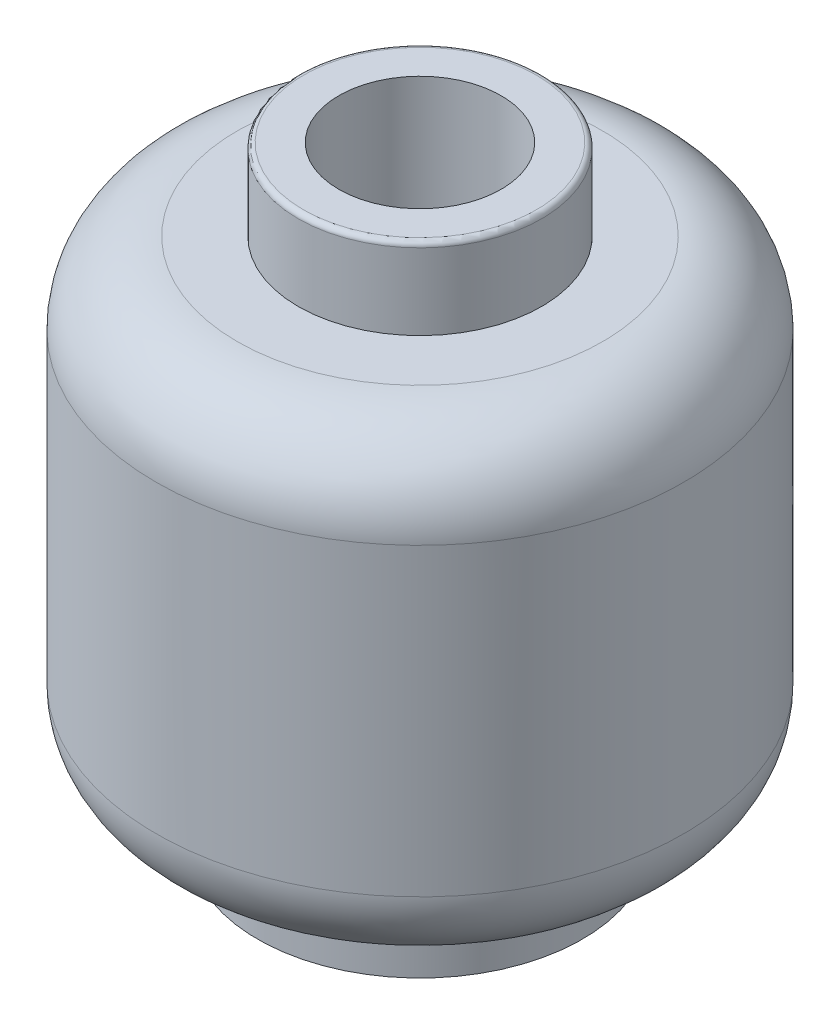
ISO-10303-21;
HEADER;
FILE_DESCRIPTION(('STEP AP214'),'2;1');
FILE_NAME('part.step','',(''),(''),'','','');
FILE_SCHEMA(('AUTOMOTIVE_DESIGN { 1 0 10303 214 1 1 1 1 }'));
ENDSEC;
DATA;
#1=APPLICATION_CONTEXT('core data for automotive mechanical design processes');
#2=APPLICATION_PROTOCOL_DEFINITION('international standard','automotive_design',2000,#1);
#3=PRODUCT_CONTEXT('',#1,'mechanical');
#4=PRODUCT('Part','Part','',(#3));
#5=PRODUCT_RELATED_PRODUCT_CATEGORY('part','',(#4));
#6=PRODUCT_DEFINITION_FORMATION('','',#4);
#7=PRODUCT_DEFINITION_CONTEXT('part definition',#1,'design');
#8=PRODUCT_DEFINITION('design','',#6,#7);
#9=PRODUCT_DEFINITION_SHAPE('','',#8);
#10=(LENGTH_UNIT() NAMED_UNIT(*) SI_UNIT(.MILLI.,.METRE.));
#11=(NAMED_UNIT(*) PLANE_ANGLE_UNIT() SI_UNIT($,.RADIAN.));
#12=(NAMED_UNIT(*) SI_UNIT($,.STERADIAN.) SOLID_ANGLE_UNIT());
#13=UNCERTAINTY_MEASURE_WITH_UNIT(LENGTH_MEASURE(1.E-05),#10,'distance_accuracy_value','');
#14=(GEOMETRIC_REPRESENTATION_CONTEXT(3) GLOBAL_UNCERTAINTY_ASSIGNED_CONTEXT((#13)) GLOBAL_UNIT_ASSIGNED_CONTEXT((#10,
#11,#12)) REPRESENTATION_CONTEXT('',''));
#15=CARTESIAN_POINT('',(0.,0.,0.));
#16=DIRECTION('',(0.,0.,1.));
#17=DIRECTION('',(1.,0.,0.));
#18=AXIS2_PLACEMENT_3D('',#15,#16,#17);
#19=CARTESIAN_POINT('',(5.159375,11.90625,-5.159375));
#20=DIRECTION('',(0.,-1.,0.));
#21=DIRECTION('',(0.,0.,-1.));
#22=AXIS2_PLACEMENT_3D('',#19,#20,#21);
#23=CYLINDRICAL_SURFACE('',#22,5.159375);
#24=CARTESIAN_POINT('',(5.159375,2.778125,-5.159375));
#25=DIRECTION('',(0.,-1.,0.));
#26=DIRECTION('',(0.,0.,-1.));
#27=AXIS2_PLACEMENT_3D('',#24,#25,#26);
#28=CIRCLE('',#27,5.159375);
#29=CARTESIAN_POINT('',(5.159375,2.778125,-10.31875));
#30=VERTEX_POINT('',#29);
#31=EDGE_CURVE('E54',#30,#30,#28,.F.);
#32=ORIENTED_EDGE('',*,*,#31,.T.);
#33=EDGE_LOOP('',(#32));
#34=FACE_BOUND('',#33,.T.);
#35=CARTESIAN_POINT('',(5.159375,8.73125,-5.159375));
#36=DIRECTION('',(0.,1.,0.));
#37=DIRECTION('',(0.,0.,1.));
#38=AXIS2_PLACEMENT_3D('',#35,#36,#37);
#39=CIRCLE('',#38,5.159375);
#40=CARTESIAN_POINT('',(5.159375,8.73125,0.));
#41=VERTEX_POINT('',#40);
#42=EDGE_CURVE('E60',#41,#41,#39,.F.);
#43=ORIENTED_EDGE('',*,*,#42,.T.);
#44=EDGE_LOOP('',(#43));
#45=FACE_BOUND('',#44,.T.);
#46=ADVANCED_FACE('F34',(#34,#45),#23,.T.);
#47=CARTESIAN_POINT('',(5.159375,10.31875,-5.159375));
#48=DIRECTION('',(0.,1.,0.));
#49=DIRECTION('',(0.,0.,1.));
#50=AXIS2_PLACEMENT_3D('',#47,#48,#49);
#51=PLANE('',#50);
#52=CARTESIAN_POINT('',(5.159375,10.31875,-5.159375));
#53=DIRECTION('',(0.,1.,0.));
#54=DIRECTION('',(0.,0.,1.));
#55=AXIS2_PLACEMENT_3D('',#52,#53,#54);
#56=CIRCLE('',#55,3.571875);
#57=CARTESIAN_POINT('',(5.159375,10.31875,-1.5875));
#58=VERTEX_POINT('',#57);
#59=EDGE_CURVE('E48',#58,#58,#56,.T.);
#60=ORIENTED_EDGE('',*,*,#59,.T.);
#61=EDGE_LOOP('',(#60));
#62=FACE_BOUND('',#61,.T.);
#63=CARTESIAN_POINT('',(5.159375,10.31875,-5.159375));
#64=DIRECTION('',(0.,1.,0.));
#65=DIRECTION('',(0.,0.,1.));
#66=AXIS2_PLACEMENT_3D('',#63,#64,#65);
#67=CIRCLE('',#66,2.38125);
#68=CARTESIAN_POINT('',(5.159375,10.31875,-2.778125));
#69=VERTEX_POINT('',#68);
#70=EDGE_CURVE('E68',#69,#69,#67,.T.);
#71=ORIENTED_EDGE('',*,*,#70,.F.);
#72=EDGE_LOOP('',(#71));
#73=FACE_BOUND('',#72,.T.);
#74=ADVANCED_FACE('F119',(#62,#73),#51,.T.);
#75=CARTESIAN_POINT('',(5.159375,10.31875,-5.159375));
#76=DIRECTION('',(0.,1.,0.));
#77=DIRECTION('',(0.,0.,1.));
#78=AXIS2_PLACEMENT_3D('',#75,#76,#77);
#79=CYLINDRICAL_SURFACE('',#78,2.38125);
#80=CARTESIAN_POINT('',(5.159375,11.80465,-5.159375));
#81=DIRECTION('',(0.,1.,0.));
#82=DIRECTION('',(0.,0.,1.));
#83=AXIS2_PLACEMENT_3D('',#80,#81,#82);
#84=CIRCLE('',#83,2.38125);
#85=CARTESIAN_POINT('',(5.159375,11.80465,-2.778125));
#86=VERTEX_POINT('',#85);
#87=EDGE_CURVE('E10',#86,#86,#84,.F.);
#88=ORIENTED_EDGE('',*,*,#87,.T.);
#89=EDGE_LOOP('',(#88));
#90=FACE_BOUND('',#89,.T.);
#91=ORIENTED_EDGE('',*,*,#70,.T.);
#92=EDGE_LOOP('',(#91));
#93=FACE_BOUND('',#92,.T.);
#94=ADVANCED_FACE('F110',(#90,#93),#79,.T.);
#95=CARTESIAN_POINT('',(5.159375,11.90625,-5.159375));
#96=DIRECTION('',(0.,1.,0.));
#97=DIRECTION('',(0.,0.,1.));
#98=AXIS2_PLACEMENT_3D('',#95,#96,#97);
#99=PLANE('',#98);
#100=CARTESIAN_POINT('',(5.159375,11.90625,-5.159375));
#101=DIRECTION('',(0.,1.,0.));
#102=DIRECTION('',(0.,0.,1.));
#103=AXIS2_PLACEMENT_3D('',#100,#101,#102);
#104=CIRCLE('',#103,2.27965);
#105=CARTESIAN_POINT('',(5.159375,11.90625,-2.879725));
#106=VERTEX_POINT('',#105);
#107=EDGE_CURVE('E42',#106,#106,#104,.T.);
#108=ORIENTED_EDGE('',*,*,#107,.T.);
#109=EDGE_LOOP('',(#108));
#110=FACE_BOUND('',#109,.T.);
#111=CARTESIAN_POINT('',(5.159375,11.90625,-5.159375));
#112=DIRECTION('',(0.,1.,0.));
#113=DIRECTION('',(0.,0.,1.));
#114=AXIS2_PLACEMENT_3D('',#111,#112,#113);
#115=CIRCLE('',#114,1.5875);
#116=CARTESIAN_POINT('',(5.159375,11.90625,-3.571875));
#117=VERTEX_POINT('',#116);
#118=EDGE_CURVE('E89',#117,#117,#115,.T.);
#119=ORIENTED_EDGE('',*,*,#118,.F.);
#120=EDGE_LOOP('',(#119));
#121=FACE_BOUND('',#120,.T.);
#122=ADVANCED_FACE('F107',(#110,#121),#99,.T.);
#123=CARTESIAN_POINT('',(5.159375,1.190625,-5.159375));
#124=DIRECTION('',(0.,-1.,0.));
#125=DIRECTION('',(0.,0.,-1.));
#126=AXIS2_PLACEMENT_3D('',#123,#124,#125);
#127=PLANE('',#126);
#128=CARTESIAN_POINT('',(5.159375,1.190625,-5.159375));
#129=DIRECTION('',(0.,-1.,0.));
#130=DIRECTION('',(0.,0.,-1.));
#131=AXIS2_PLACEMENT_3D('',#128,#129,#130);
#132=CIRCLE('',#131,3.571875);
#133=CARTESIAN_POINT('',(5.159375,1.190625,-8.73125));
#134=VERTEX_POINT('',#133);
#135=EDGE_CURVE('E64',#134,#134,#132,.T.);
#136=ORIENTED_EDGE('',*,*,#135,.T.);
#137=EDGE_LOOP('',(#136));
#138=FACE_BOUND('',#137,.T.);
#139=CARTESIAN_POINT('',(5.159375,1.190625,-5.159375));
#140=DIRECTION('',(0.,-1.,0.));
#141=DIRECTION('',(0.,0.,-1.));
#142=AXIS2_PLACEMENT_3D('',#139,#140,#141);
#143=CIRCLE('',#142,3.175);
#144=CARTESIAN_POINT('',(5.159375,1.190625,-8.334375));
#145=VERTEX_POINT('',#144);
#146=EDGE_CURVE('E72',#145,#145,#143,.T.);
#147=ORIENTED_EDGE('',*,*,#146,.F.);
#148=EDGE_LOOP('',(#147));
#149=FACE_BOUND('',#148,.T.);
#150=ADVANCED_FACE('F109',(#138,#149),#127,.T.);
#151=CARTESIAN_POINT('',(5.159375,1.190625,-5.159375));
#152=DIRECTION('',(0.,-1.,0.));
#153=DIRECTION('',(0.,0.,-1.));
#154=AXIS2_PLACEMENT_3D('',#151,#152,#153);
#155=CYLINDRICAL_SURFACE('',#154,3.175);
#156=CARTESIAN_POINT('',(5.159375,0.,-5.159375));
#157=DIRECTION('',(0.,-1.,0.));
#158=DIRECTION('',(0.,0.,-1.));
#159=AXIS2_PLACEMENT_3D('',#156,#157,#158);
#160=CIRCLE('',#159,3.175);
#161=CARTESIAN_POINT('',(5.159375,0.,-8.334375));
#162=VERTEX_POINT('',#161);
#163=EDGE_CURVE('E73',#162,#162,#160,.T.);
#164=CARTESIAN_POINT('',(5.159375,1.190625,-8.334375));
#165=CARTESIAN_POINT('',(5.159375,1.17822265625,-8.334375));
#166=CARTESIAN_POINT('',(5.159375,1.1658203125,-8.334375));
#167=CARTESIAN_POINT('',(5.159375,1.141015625,-8.334375));
#168=CARTESIAN_POINT('',(5.159375,1.12861328125,-8.334375));
#169=CARTESIAN_POINT('',(5.159375,1.10380859375,-8.334375));
#170=CARTESIAN_POINT('',(5.159375,1.09140625,-8.334375));
#171=CARTESIAN_POINT('',(5.159375,1.0666015625,-8.334375));
#172=CARTESIAN_POINT('',(5.159375,1.05419921875,-8.334375));
#173=CARTESIAN_POINT('',(5.159375,1.02939453125,-8.334375));
#174=CARTESIAN_POINT('',(5.159375,1.0169921875,-8.334375));
#175=CARTESIAN_POINT('',(5.159375,0.9921875,-8.334375));
#176=CARTESIAN_POINT('',(5.159375,0.97978515625,-8.334375));
#177=CARTESIAN_POINT('',(5.159375,0.95498046875,-8.334375));
#178=CARTESIAN_POINT('',(5.159375,0.942578125,-8.334375));
#179=CARTESIAN_POINT('',(5.159375,0.9177734375,-8.334375));
#180=CARTESIAN_POINT('',(5.159375,0.90537109375,-8.334375));
#181=CARTESIAN_POINT('',(5.159375,0.88056640625,-8.334375));
#182=CARTESIAN_POINT('',(5.159375,0.8681640625,-8.334375));
#183=CARTESIAN_POINT('',(5.159375,0.843359375,-8.334375));
#184=CARTESIAN_POINT('',(5.159375,0.83095703125,-8.334375));
#185=CARTESIAN_POINT('',(5.159375,0.80615234375,-8.334375));
#186=CARTESIAN_POINT('',(5.159375,0.79375,-8.334375));
#187=CARTESIAN_POINT('',(5.159375,0.7689453125,-8.334375));
#188=CARTESIAN_POINT('',(5.159375,0.75654296875,-8.334375));
#189=CARTESIAN_POINT('',(5.159375,0.73173828125,-8.334375));
#190=CARTESIAN_POINT('',(5.159375,0.7193359375,-8.334375));
#191=CARTESIAN_POINT('',(5.159375,0.69453125,-8.334375));
#192=CARTESIAN_POINT('',(5.159375,0.68212890625,-8.334375));
#193=CARTESIAN_POINT('',(5.159375,0.65732421875,-8.334375));
#194=CARTESIAN_POINT('',(5.159375,0.644921875,-8.334375));
#195=CARTESIAN_POINT('',(5.159375,0.6201171875,-8.334375));
#196=CARTESIAN_POINT('',(5.159375,0.60771484375,-8.334375));
#197=CARTESIAN_POINT('',(5.159375,0.58291015625,-8.334375));
#198=CARTESIAN_POINT('',(5.159375,0.5705078125,-8.334375));
#199=CARTESIAN_POINT('',(5.159375,0.545703125,-8.334375));
#200=CARTESIAN_POINT('',(5.159375,0.53330078125,-8.334375));
#201=CARTESIAN_POINT('',(5.159375,0.50849609375,-8.334375));
#202=CARTESIAN_POINT('',(5.159375,0.49609375,-8.334375));
#203=CARTESIAN_POINT('',(5.159375,0.4712890625,-8.334375));
#204=CARTESIAN_POINT('',(5.159375,0.45888671875,-8.334375));
#205=CARTESIAN_POINT('',(5.159375,0.43408203125,-8.334375));
#206=CARTESIAN_POINT('',(5.159375,0.4216796875,-8.334375));
#207=CARTESIAN_POINT('',(5.159375,0.396875,-8.334375));
#208=CARTESIAN_POINT('',(5.159375,0.38447265625,-8.334375));
#209=CARTESIAN_POINT('',(5.159375,0.35966796875,-8.334375));
#210=CARTESIAN_POINT('',(5.159375,0.347265625,-8.334375));
#211=CARTESIAN_POINT('',(5.159375,0.3224609375,-8.334375));
#212=CARTESIAN_POINT('',(5.159375,0.31005859375,-8.334375));
#213=CARTESIAN_POINT('',(5.159375,0.28525390625,-8.334375));
#214=CARTESIAN_POINT('',(5.159375,0.2728515625,-8.334375));
#215=CARTESIAN_POINT('',(5.159375,0.248046875,-8.334375));
#216=CARTESIAN_POINT('',(5.159375,0.23564453125,-8.334375));
#217=CARTESIAN_POINT('',(5.159375,0.21083984375,-8.334375));
#218=CARTESIAN_POINT('',(5.159375,0.1984375,-8.334375));
#219=CARTESIAN_POINT('',(5.159375,0.1736328125,-8.334375));
#220=CARTESIAN_POINT('',(5.159375,0.16123046875,-8.334375));
#221=CARTESIAN_POINT('',(5.159375,0.13642578125,-8.334375));
#222=CARTESIAN_POINT('',(5.159375,0.1240234375,-8.334375));
#223=CARTESIAN_POINT('',(5.159375,0.0992187500000001,-8.334375));
#224=CARTESIAN_POINT('',(5.159375,0.08681640625,-8.334375));
#225=CARTESIAN_POINT('',(5.159375,0.06201171875,-8.334375));
#226=CARTESIAN_POINT('',(5.159375,0.049609375,-8.334375));
#227=CARTESIAN_POINT('',(5.159375,0.0248046875,-8.334375));
#228=CARTESIAN_POINT('',(5.159375,0.01240234375,-8.334375));
#229=CARTESIAN_POINT('',(5.159375,0.,-8.334375));
#230=B_SPLINE_CURVE_WITH_KNOTS('',3,(#164,#165,#166,#167,#168,#169,#170,#171,#172,#173,#174,
#175,#176,#177,#178,#179,#180,#181,#182,#183,#184,#185,#186,#187,#188,#189,#190,#191,#192,#193,
#194,#195,#196,#197,#198,#199,#200,#201,#202,#203,#204,#205,#206,#207,#208,#209,#210,#211,#212,
#213,#214,#215,#216,#217,#218,#219,#220,#221,#222,#223,#224,#225,#226,#227,#228,#229),
.UNSPECIFIED.,.F.,.F.,(4,2,2,2,2,2,2,2,2,2,2,2,2,2,2,2,2,2,2,2,2,2,2,2,2,2,2,2,2,2,2,2,4),(0.,
0.03720703125,0.0744140625,0.11162109375,0.148828125,0.18603515625,0.2232421875,0.26044921875,
0.29765625,0.33486328125,0.3720703125,0.40927734375,0.446484375,0.48369140625,0.5208984375,
0.55810546875,0.5953125,0.63251953125,0.6697265625,0.70693359375,0.744140625,0.78134765625,
0.8185546875,0.85576171875,0.89296875,0.93017578125,0.9673828125,1.00458984375,1.041796875,
1.07900390625,1.1162109375,1.15341796875,1.190625),.UNSPECIFIED.);
#231=EDGE_CURVE('BSEAM116',#145,#162,#230,.T.);
#232=ORIENTED_EDGE('',*,*,#146,.T.);
#233=ORIENTED_EDGE('',*,*,#163,.F.);
#234=ORIENTED_EDGE('',*,*,#231,.T.);
#235=ORIENTED_EDGE('',*,*,#231,.F.);
#236=EDGE_LOOP('',(#232,#234,#233,#235));
#237=FACE_BOUND('',#236,.T.);
#238=ADVANCED_FACE('F116',(#237),#155,.T.);
#239=CARTESIAN_POINT('',(5.159375,0.,-5.159375));
#240=DIRECTION('',(0.,1.,0.));
#241=DIRECTION('',(0.,0.,1.));
#242=AXIS2_PLACEMENT_3D('',#239,#240,#241);
#243=PLANE('',#242);
#244=CARTESIAN_POINT('',(5.159375,0.,-5.159375));
#245=DIRECTION('',(0.,-1.,0.));
#246=DIRECTION('',(0.,0.,-1.));
#247=AXIS2_PLACEMENT_3D('',#244,#245,#246);
#248=CIRCLE('',#247,2.38125);
#249=CARTESIAN_POINT('',(5.159375,0.,-7.540625));
#250=VERTEX_POINT('',#249);
#251=EDGE_CURVE('E81',#250,#250,#248,.T.);
#252=ORIENTED_EDGE('',*,*,#251,.F.);
#253=EDGE_LOOP('',(#252));
#254=FACE_BOUND('',#253,.T.);
#255=ORIENTED_EDGE('',*,*,#163,.T.);
#256=EDGE_LOOP('',(#255));
#257=FACE_BOUND('',#256,.T.);
#258=ADVANCED_FACE('F132',(#254,#257),#243,.F.);
#259=CARTESIAN_POINT('',(5.159375,8.73125,-5.159375));
#260=DIRECTION('',(0.,-1.,0.));
#261=DIRECTION('',(0.,0.,-1.));
#262=AXIS2_PLACEMENT_3D('',#259,#260,#261);
#263=CYLINDRICAL_SURFACE('',#262,2.38125);
#264=CARTESIAN_POINT('',(5.159375,8.73125,-5.159375));
#265=DIRECTION('',(0.,-1.,0.));
#266=DIRECTION('',(0.,0.,-1.));
#267=AXIS2_PLACEMENT_3D('',#264,#265,#266);
#268=CIRCLE('',#267,2.38125);
#269=CARTESIAN_POINT('',(5.159375,8.73125,-7.540625));
#270=VERTEX_POINT('',#269);
#271=EDGE_CURVE('E77',#270,#270,#268,.T.);
#272=ORIENTED_EDGE('',*,*,#271,.F.);
#273=EDGE_LOOP('',(#272));
#274=FACE_BOUND('',#273,.T.);
#275=ORIENTED_EDGE('',*,*,#251,.T.);
#276=EDGE_LOOP('',(#275));
#277=FACE_BOUND('',#276,.T.);
#278=ADVANCED_FACE('F180',(#274,#277),#263,.F.);
#279=CARTESIAN_POINT('',(5.159375,8.73125,-5.159375));
#280=DIRECTION('',(0.,-1.,0.));
#281=DIRECTION('',(0.,0.,-1.));
#282=AXIS2_PLACEMENT_3D('',#279,#280,#281);
#283=PLANE('',#282);
#284=ORIENTED_EDGE('',*,*,#271,.T.);
#285=EDGE_LOOP('',(#284));
#286=FACE_BOUND('',#285,.T.);
#287=ADVANCED_FACE('F103',(#286),#283,.T.);
#288=CARTESIAN_POINT('',(5.159375,9.525,-5.159375));
#289=DIRECTION('',(0.,1.,0.));
#290=DIRECTION('',(0.,0.,1.));
#291=AXIS2_PLACEMENT_3D('',#288,#289,#290);
#292=CYLINDRICAL_SURFACE('',#291,1.5875);
#293=CARTESIAN_POINT('',(5.159375,9.525,-5.159375));
#294=DIRECTION('',(0.,1.,0.));
#295=DIRECTION('',(0.,0.,1.));
#296=AXIS2_PLACEMENT_3D('',#293,#294,#295);
#297=CIRCLE('',#296,1.5875);
#298=CARTESIAN_POINT('',(5.159375,9.525,-3.571875));
#299=VERTEX_POINT('',#298);
#300=EDGE_CURVE('E85',#299,#299,#297,.T.);
#301=CARTESIAN_POINT('',(5.159375,9.525,-3.571875));
#302=CARTESIAN_POINT('',(5.159375,9.5498046875,-3.571875));
#303=CARTESIAN_POINT('',(5.159375,9.574609375,-3.571875));
#304=CARTESIAN_POINT('',(5.159375,9.62421875,-3.571875));
#305=CARTESIAN_POINT('',(5.159375,9.6490234375,-3.571875));
#306=CARTESIAN_POINT('',(5.159375,9.6986328125,-3.571875));
#307=CARTESIAN_POINT('',(5.159375,9.7234375,-3.571875));
#308=CARTESIAN_POINT('',(5.159375,9.773046875,-3.571875));
#309=CARTESIAN_POINT('',(5.159375,9.7978515625,-3.571875));
#310=CARTESIAN_POINT('',(5.159375,9.8474609375,-3.571875));
#311=CARTESIAN_POINT('',(5.159375,9.872265625,-3.571875));
#312=CARTESIAN_POINT('',(5.159375,9.921875,-3.571875));
#313=CARTESIAN_POINT('',(5.159375,9.9466796875,-3.571875));
#314=CARTESIAN_POINT('',(5.159375,9.9962890625,-3.571875));
#315=CARTESIAN_POINT('',(5.159375,10.02109375,-3.571875));
#316=CARTESIAN_POINT('',(5.159375,10.070703125,-3.571875));
#317=CARTESIAN_POINT('',(5.159375,10.0955078125,-3.571875));
#318=CARTESIAN_POINT('',(5.159375,10.1451171875,-3.571875));
#319=CARTESIAN_POINT('',(5.159375,10.169921875,-3.571875));
#320=CARTESIAN_POINT('',(5.159375,10.21953125,-3.571875));
#321=CARTESIAN_POINT('',(5.159375,10.2443359375,-3.571875));
#322=CARTESIAN_POINT('',(5.159375,10.2939453125,-3.571875));
#323=CARTESIAN_POINT('',(5.159375,10.31875,-3.571875));
#324=CARTESIAN_POINT('',(5.159375,10.368359375,-3.571875));
#325=CARTESIAN_POINT('',(5.159375,10.3931640625,-3.571875));
#326=CARTESIAN_POINT('',(5.159375,10.4427734375,-3.571875));
#327=CARTESIAN_POINT('',(5.159375,10.467578125,-3.571875));
#328=CARTESIAN_POINT('',(5.159375,10.5171875,-3.571875));
#329=CARTESIAN_POINT('',(5.159375,10.5419921875,-3.571875));
#330=CARTESIAN_POINT('',(5.159375,10.5916015625,-3.571875));
#331=CARTESIAN_POINT('',(5.159375,10.61640625,-3.571875));
#332=CARTESIAN_POINT('',(5.159375,10.666015625,-3.571875));
#333=CARTESIAN_POINT('',(5.159375,10.6908203125,-3.571875));
#334=CARTESIAN_POINT('',(5.159375,10.7404296875,-3.571875));
#335=CARTESIAN_POINT('',(5.159375,10.765234375,-3.571875));
#336=CARTESIAN_POINT('',(5.159375,10.81484375,-3.571875));
#337=CARTESIAN_POINT('',(5.159375,10.8396484375,-3.571875));
#338=CARTESIAN_POINT('',(5.159375,10.8892578125,-3.571875));
#339=CARTESIAN_POINT('',(5.159375,10.9140625,-3.571875));
#340=CARTESIAN_POINT('',(5.159375,10.963671875,-3.571875));
#341=CARTESIAN_POINT('',(5.159375,10.9884765625,-3.571875));
#342=CARTESIAN_POINT('',(5.159375,11.0380859375,-3.571875));
#343=CARTESIAN_POINT('',(5.159375,11.062890625,-3.571875));
#344=CARTESIAN_POINT('',(5.159375,11.1125,-3.571875));
#345=CARTESIAN_POINT('',(5.159375,11.1373046875,-3.571875));
#346=CARTESIAN_POINT('',(5.159375,11.1869140625,-3.571875));
#347=CARTESIAN_POINT('',(5.159375,11.21171875,-3.571875));
#348=CARTESIAN_POINT('',(5.159375,11.261328125,-3.571875));
#349=CARTESIAN_POINT('',(5.159375,11.2861328125,-3.571875));
#350=CARTESIAN_POINT('',(5.159375,11.3357421875,-3.571875));
#351=CARTESIAN_POINT('',(5.159375,11.360546875,-3.571875));
#352=CARTESIAN_POINT('',(5.159375,11.41015625,-3.571875));
#353=CARTESIAN_POINT('',(5.159375,11.4349609375,-3.571875));
#354=CARTESIAN_POINT('',(5.159375,11.4845703125,-3.571875));
#355=CARTESIAN_POINT('',(5.159375,11.509375,-3.571875));
#356=CARTESIAN_POINT('',(5.159375,11.558984375,-3.571875));
#357=CARTESIAN_POINT('',(5.159375,11.5837890625,-3.571875));
#358=CARTESIAN_POINT('',(5.159375,11.6333984375,-3.571875));
#359=CARTESIAN_POINT('',(5.159375,11.658203125,-3.571875));
#360=CARTESIAN_POINT('',(5.159375,11.7078125,-3.571875));
#361=CARTESIAN_POINT('',(5.159375,11.7326171875,-3.571875));
#362=CARTESIAN_POINT('',(5.159375,11.7822265625,-3.571875));
#363=CARTESIAN_POINT('',(5.159375,11.80703125,-3.571875));
#364=CARTESIAN_POINT('',(5.159375,11.856640625,-3.571875));
#365=CARTESIAN_POINT('',(5.159375,11.8814453125,-3.571875));
#366=CARTESIAN_POINT('',(5.159375,11.90625,-3.571875));
#367=B_SPLINE_CURVE_WITH_KNOTS('',3,(#301,#302,#303,#304,#305,#306,#307,#308,#309,#310,#311,
#312,#313,#314,#315,#316,#317,#318,#319,#320,#321,#322,#323,#324,#325,#326,#327,#328,#329,#330,
#331,#332,#333,#334,#335,#336,#337,#338,#339,#340,#341,#342,#343,#344,#345,#346,#347,#348,#349,
#350,#351,#352,#353,#354,#355,#356,#357,#358,#359,#360,#361,#362,#363,#364,#365,#366),
.UNSPECIFIED.,.F.,.F.,(4,2,2,2,2,2,2,2,2,2,2,2,2,2,2,2,2,2,2,2,2,2,2,2,2,2,2,2,2,2,2,2,4),(0.,
0.0744140625,0.148828125,0.2232421875,0.29765625,0.3720703125,0.446484375,0.5208984375,
0.5953125,0.6697265625,0.744140625,0.8185546875,0.892968750000001,0.967382812500001,1.041796875,
1.1162109375,1.190625,1.2650390625,1.339453125,1.4138671875,1.48828125,1.5626953125,1.637109375,
1.7115234375,1.7859375,1.8603515625,1.934765625,2.0091796875,2.08359375,2.1580078125,
2.232421875,2.3068359375,2.38125),.UNSPECIFIED.);
#368=EDGE_CURVE('BSEAM100',#299,#117,#367,.T.);
#369=ORIENTED_EDGE('',*,*,#300,.F.);
#370=ORIENTED_EDGE('',*,*,#118,.T.);
#371=ORIENTED_EDGE('',*,*,#368,.T.);
#372=ORIENTED_EDGE('',*,*,#368,.F.);
#373=EDGE_LOOP('',(#369,#371,#370,#372));
#374=FACE_BOUND('',#373,.T.);
#375=ADVANCED_FACE('F100',(#374),#292,.F.);
#376=CARTESIAN_POINT('',(5.159375,9.525,-5.159375));
#377=DIRECTION('',(0.,1.,0.));
#378=DIRECTION('',(0.,0.,1.));
#379=AXIS2_PLACEMENT_3D('',#376,#377,#378);
#380=PLANE('',#379);
#381=ORIENTED_EDGE('',*,*,#300,.T.);
#382=EDGE_LOOP('',(#381));
#383=FACE_BOUND('',#382,.T.);
#384=ADVANCED_FACE('F98',(#383),#380,.T.);
#385=CARTESIAN_POINT('',(5.159375,2.778125,-5.159375));
#386=DIRECTION('',(0.,-1.,0.));
#387=DIRECTION('',(0.,0.,-1.));
#388=AXIS2_PLACEMENT_3D('',#385,#386,#387);
#389=TOROIDAL_SURFACE('',#388,3.571875,1.5875);
#390=ORIENTED_EDGE('',*,*,#31,.F.);
#391=EDGE_LOOP('',(#390));
#392=FACE_BOUND('',#391,.T.);
#393=ORIENTED_EDGE('',*,*,#135,.F.);
#394=EDGE_LOOP('',(#393));
#395=FACE_BOUND('',#394,.T.);
#396=ADVANCED_FACE('F133',(#392,#395),#389,.T.);
#397=CARTESIAN_POINT('',(5.159375,8.73125,-5.159375));
#398=DIRECTION('',(0.,1.,0.));
#399=DIRECTION('',(0.,0.,1.));
#400=AXIS2_PLACEMENT_3D('',#397,#398,#399);
#401=TOROIDAL_SURFACE('',#400,3.571875,1.5875);
#402=ORIENTED_EDGE('',*,*,#42,.F.);
#403=EDGE_LOOP('',(#402));
#404=FACE_BOUND('',#403,.T.);
#405=ORIENTED_EDGE('',*,*,#59,.F.);
#406=EDGE_LOOP('',(#405));
#407=FACE_BOUND('',#406,.T.);
#408=ADVANCED_FACE('F135',(#404,#407),#401,.T.);
#409=CARTESIAN_POINT('',(5.159375,11.80465,-5.159375));
#410=DIRECTION('',(0.,1.,0.));
#411=DIRECTION('',(0.,0.,1.));
#412=AXIS2_PLACEMENT_3D('',#409,#410,#411);
#413=TOROIDAL_SURFACE('',#412,2.27965,0.1016);
#414=ORIENTED_EDGE('',*,*,#87,.F.);
#415=EDGE_LOOP('',(#414));
#416=FACE_BOUND('',#415,.T.);
#417=ORIENTED_EDGE('',*,*,#107,.F.);
#418=EDGE_LOOP('',(#417));
#419=FACE_BOUND('',#418,.T.);
#420=ADVANCED_FACE('F36',(#416,#419),#413,.T.);
#421=CLOSED_SHELL('',(#46,#74,#94,#122,#150,#238,#258,#278,#287,#375,#384,#396,#408,#420));
#422=MANIFOLD_SOLID_BREP('B2',#421);
#423=ADVANCED_BREP_SHAPE_REPRESENTATION('',(#18,#422),#14);
#424=SHAPE_DEFINITION_REPRESENTATION(#9,#423);
ENDSEC;
END-ISO-10303-21;
